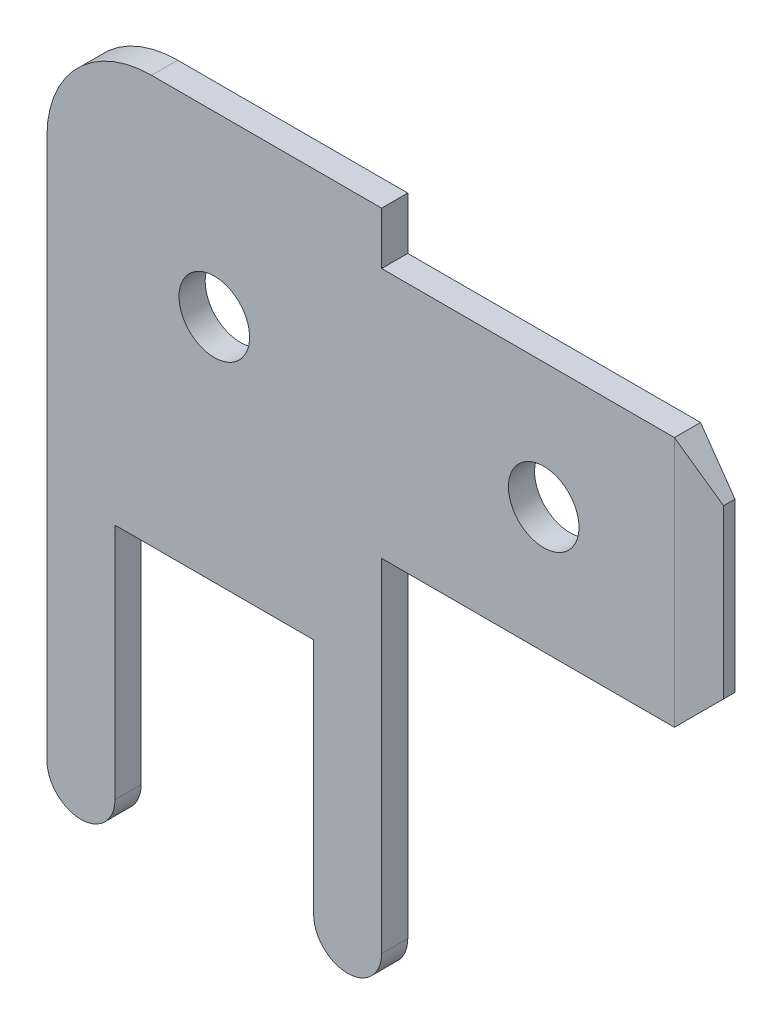
ISO-10303-21;
HEADER;
FILE_DESCRIPTION(('STEP AP214'),'2;1');
FILE_NAME('part.step','',(''),(''),'','','');
FILE_SCHEMA(('AUTOMOTIVE_DESIGN { 1 0 10303 214 1 1 1 1 }'));
ENDSEC;
DATA;
#1=APPLICATION_CONTEXT('core data for automotive mechanical design processes');
#2=APPLICATION_PROTOCOL_DEFINITION('international standard','automotive_design',2000,#1);
#3=PRODUCT_CONTEXT('',#1,'mechanical');
#4=PRODUCT('Part','Part','',(#3));
#5=PRODUCT_RELATED_PRODUCT_CATEGORY('part','',(#4));
#6=PRODUCT_DEFINITION_FORMATION('','',#4);
#7=PRODUCT_DEFINITION_CONTEXT('part definition',#1,'design');
#8=PRODUCT_DEFINITION('design','',#6,#7);
#9=PRODUCT_DEFINITION_SHAPE('','',#8);
#10=(LENGTH_UNIT() NAMED_UNIT(*) SI_UNIT(.MILLI.,.METRE.));
#11=(NAMED_UNIT(*) PLANE_ANGLE_UNIT() SI_UNIT($,.RADIAN.));
#12=(NAMED_UNIT(*) SI_UNIT($,.STERADIAN.) SOLID_ANGLE_UNIT());
#13=UNCERTAINTY_MEASURE_WITH_UNIT(LENGTH_MEASURE(1.E-05),#10,'distance_accuracy_value','');
#14=(GEOMETRIC_REPRESENTATION_CONTEXT(3) GLOBAL_UNCERTAINTY_ASSIGNED_CONTEXT((#13)) GLOBAL_UNIT_ASSIGNED_CONTEXT((#10,
#11,#12)) REPRESENTATION_CONTEXT('',''));
#15=CARTESIAN_POINT('',(0.,0.,0.));
#16=DIRECTION('',(0.,0.,1.));
#17=DIRECTION('',(1.,0.,0.));
#18=AXIS2_PLACEMENT_3D('',#15,#16,#17);
#19=CARTESIAN_POINT('',(9.6,0.,-0.141061584567));
#20=DIRECTION('',(-0.173648177667033,0.,-0.98480775301219));
#21=DIRECTION('',(-0.98480775301219,0.,0.173648177667033));
#22=AXIS2_PLACEMENT_3D('',#19,#20,#21);
#23=PLANE('',#22);
#24=DIRECTION('',(-0.701673843159846,-0.701673843159846,0.123724030206681));
#25=VECTOR('',#24,1.);
#26=CARTESIAN_POINT('',(9.6,2.8,-0.141061584567));
#27=LINE('',#26,#25);
#28=CARTESIAN_POINT('',(9.6,2.8,-0.141061584567));
#29=VERTEX_POINT('',#28);
#30=CARTESIAN_POINT('',(8.8,2.,0.));
#31=VERTEX_POINT('',#30);
#32=EDGE_CURVE('E195',#29,#31,#27,.T.);
#33=ORIENTED_EDGE('',*,*,#32,.F.);
#34=DIRECTION('',(0.,1.,0.));
#35=VECTOR('',#34,1.);
#36=CARTESIAN_POINT('',(9.6,2.8,-0.141061584567));
#37=LINE('',#36,#35);
#38=CARTESIAN_POINT('',(9.6,6.,-0.141061584567));
#39=VERTEX_POINT('',#38);
#40=EDGE_CURVE('E247',#39,#29,#37,.F.);
#41=ORIENTED_EDGE('',*,*,#40,.F.);
#42=DIRECTION('',(0.701673843159846,-0.701673843159846,-0.123724030206681));
#43=VECTOR('',#42,1.);
#44=CARTESIAN_POINT('',(8.8,6.8,0.));
#45=LINE('',#44,#43);
#46=CARTESIAN_POINT('',(8.8,6.8,0.));
#47=VERTEX_POINT('',#46);
#48=EDGE_CURVE('E244',#47,#39,#45,.T.);
#49=ORIENTED_EDGE('',*,*,#48,.F.);
#50=DIRECTION('',(0.,1.,0.));
#51=VECTOR('',#50,1.);
#52=CARTESIAN_POINT('',(8.8,0.,0.));
#53=LINE('',#52,#51);
#54=EDGE_CURVE('E186',#31,#47,#53,.T.);
#55=ORIENTED_EDGE('',*,*,#54,.F.);
#56=EDGE_LOOP('',(#33,#41,#49,#55));
#57=FACE_BOUND('',#56,.T.);
#58=ADVANCED_FACE('F17',(#57),#23,.F.);
#59=CARTESIAN_POINT('',(9.6,2.8,0.));
#60=DIRECTION('',(1.,0.,0.));
#61=DIRECTION('',(0.,0.,-1.));
#62=AXIS2_PLACEMENT_3D('',#59,#60,#61);
#63=PLANE('',#62);
#64=DIRECTION('',(0.,0.,1.));
#65=VECTOR('',#64,1.);
#66=CARTESIAN_POINT('',(9.6,2.8,0.));
#67=LINE('',#66,#65);
#68=CARTESIAN_POINT('',(9.60000000000002,2.8,-0.358938415433092));
#69=VERTEX_POINT('',#68);
#70=EDGE_CURVE('E197',#69,#29,#67,.T.);
#71=ORIENTED_EDGE('',*,*,#70,.F.);
#72=DIRECTION('',(0.,1.,0.));
#73=VECTOR('',#72,1.);
#74=CARTESIAN_POINT('',(9.60000000000002,0.,-0.358938415433138));
#75=LINE('',#74,#73);
#76=CARTESIAN_POINT('',(9.60000000000002,6.,-0.358938415433138));
#77=VERTEX_POINT('',#76);
#78=EDGE_CURVE('E180',#69,#77,#75,.T.);
#79=ORIENTED_EDGE('',*,*,#78,.T.);
#80=DIRECTION('',(0.,0.,1.));
#81=VECTOR('',#80,1.);
#82=CARTESIAN_POINT('',(9.6,6.,0.));
#83=LINE('',#82,#81);
#84=EDGE_CURVE('E246',#39,#77,#83,.F.);
#85=ORIENTED_EDGE('',*,*,#84,.F.);
#86=ORIENTED_EDGE('',*,*,#40,.T.);
#87=EDGE_LOOP('',(#71,#79,#85,#86));
#88=FACE_BOUND('',#87,.T.);
#89=ADVANCED_FACE('F522',(#88),#63,.T.);
#90=CARTESIAN_POINT('',(9.6,6.,0.));
#91=DIRECTION('',(0.707106781186548,0.707106781186548,0.));
#92=DIRECTION('',(-0.707106781186548,0.707106781186548,0.));
#93=AXIS2_PLACEMENT_3D('',#90,#91,#92);
#94=PLANE('',#93);
#95=ORIENTED_EDGE('',*,*,#84,.T.);
#96=DIRECTION('',(-0.701673843159867,0.701673843159846,-0.12372403020656));
#97=VECTOR('',#96,1.);
#98=CARTESIAN_POINT('',(9.60000000000002,6.,-0.358938415433138));
#99=LINE('',#98,#97);
#100=CARTESIAN_POINT('',(8.8,6.8,-0.5));
#101=VERTEX_POINT('',#100);
#102=EDGE_CURVE('E170',#77,#101,#99,.T.);
#103=ORIENTED_EDGE('',*,*,#102,.T.);
#104=DIRECTION('',(0.,0.,1.));
#105=VECTOR('',#104,1.);
#106=CARTESIAN_POINT('',(8.8,6.8,0.));
#107=LINE('',#106,#105);
#108=EDGE_CURVE('E168',#47,#101,#107,.F.);
#109=ORIENTED_EDGE('',*,*,#108,.F.);
#110=ORIENTED_EDGE('',*,*,#48,.T.);
#111=EDGE_LOOP('',(#95,#103,#109,#110));
#112=FACE_BOUND('',#111,.T.);
#113=ADVANCED_FACE('F513',(#112),#94,.T.);
#114=CARTESIAN_POINT('',(8.8,2.,0.));
#115=DIRECTION('',(0.707106781186548,-0.707106781186548,0.));
#116=DIRECTION('',(0.707106781186548,0.707106781186548,0.));
#117=AXIS2_PLACEMENT_3D('',#114,#115,#116);
#118=PLANE('',#117);
#119=DIRECTION('',(0.,0.,-1.));
#120=VECTOR('',#119,1.);
#121=CARTESIAN_POINT('',(8.8,2.,0.));
#122=LINE('',#121,#120);
#123=CARTESIAN_POINT('',(8.8,2.,-0.5));
#124=VERTEX_POINT('',#123);
#125=EDGE_CURVE('E189',#124,#31,#122,.F.);
#126=ORIENTED_EDGE('',*,*,#125,.F.);
#127=DIRECTION('',(0.701673843159867,0.701673843159847,0.12372403020656));
#128=VECTOR('',#127,1.);
#129=CARTESIAN_POINT('',(8.8,2.,-0.5));
#130=LINE('',#129,#128);
#131=EDGE_CURVE('E183',#124,#69,#130,.T.);
#132=ORIENTED_EDGE('',*,*,#131,.T.);
#133=ORIENTED_EDGE('',*,*,#70,.T.);
#134=ORIENTED_EDGE('',*,*,#32,.T.);
#135=EDGE_LOOP('',(#126,#132,#133,#134));
#136=FACE_BOUND('',#135,.T.);
#137=ADVANCED_FACE('F504',(#136),#118,.T.);
#138=CARTESIAN_POINT('',(0.,0.,0.));
#139=DIRECTION('',(0.,0.,1.));
#140=DIRECTION('',(1.,0.,0.));
#141=AXIS2_PLACEMENT_3D('',#138,#139,#140);
#142=PLANE('',#141);
#143=CARTESIAN_POINT('',(0.,4.4,0.));
#144=DIRECTION('',(0.,0.,-1.));
#145=DIRECTION('',(-1.,0.,0.));
#146=AXIS2_PLACEMENT_3D('',#143,#144,#145);
#147=CIRCLE('',#146,0.675);
#148=CARTESIAN_POINT('',(-0.675,4.4,0.));
#149=VERTEX_POINT('',#148);
#150=EDGE_CURVE('E175',#149,#149,#147,.T.);
#151=ORIENTED_EDGE('',*,*,#150,.T.);
#152=EDGE_LOOP('',(#151));
#153=FACE_BOUND('',#152,.T.);
#154=CARTESIAN_POINT('',(6.3,4.4,0.));
#155=DIRECTION('',(0.,0.,-1.));
#156=DIRECTION('',(-1.,0.,0.));
#157=AXIS2_PLACEMENT_3D('',#154,#155,#156);
#158=CIRCLE('',#157,0.675);
#159=CARTESIAN_POINT('',(5.625,4.4,0.));
#160=VERTEX_POINT('',#159);
#161=EDGE_CURVE('E204',#160,#160,#158,.T.);
#162=ORIENTED_EDGE('',*,*,#161,.T.);
#163=EDGE_LOOP('',(#162));
#164=FACE_BOUND('',#163,.T.);
#165=DIRECTION('',(1.,0.,0.));
#166=VECTOR('',#165,1.);
#167=CARTESIAN_POINT('',(3.2,2.,0.));
#168=LINE('',#167,#166);
#169=CARTESIAN_POINT('',(3.2,2.,0.));
#170=VERTEX_POINT('',#169);
#171=EDGE_CURVE('E192',#31,#170,#168,.F.);
#172=ORIENTED_EDGE('',*,*,#171,.F.);
#173=ORIENTED_EDGE('',*,*,#54,.T.);
#174=DIRECTION('',(1.,0.,0.));
#175=VECTOR('',#174,1.);
#176=CARTESIAN_POINT('',(8.8,6.8,0.));
#177=LINE('',#176,#175);
#178=CARTESIAN_POINT('',(3.2,6.8,0.));
#179=VERTEX_POINT('',#178);
#180=EDGE_CURVE('E160',#179,#47,#177,.T.);
#181=ORIENTED_EDGE('',*,*,#180,.F.);
#182=DIRECTION('',(0.,1.,0.));
#183=VECTOR('',#182,1.);
#184=CARTESIAN_POINT('',(3.2,6.8,0.));
#185=LINE('',#184,#183);
#186=CARTESIAN_POINT('',(3.2,7.8,0.));
#187=VERTEX_POINT('',#186);
#188=EDGE_CURVE('E128',#187,#179,#185,.F.);
#189=ORIENTED_EDGE('',*,*,#188,.F.);
#190=DIRECTION('',(1.,0.,0.));
#191=VECTOR('',#190,1.);
#192=CARTESIAN_POINT('',(3.2,7.8,0.));
#193=LINE('',#192,#191);
#194=CARTESIAN_POINT('',(-1.2,7.8,0.));
#195=VERTEX_POINT('',#194);
#196=EDGE_CURVE('E124',#195,#187,#193,.T.);
#197=ORIENTED_EDGE('',*,*,#196,.F.);
#198=CARTESIAN_POINT('',(-1.2,5.8,0.));
#199=DIRECTION('',(0.,0.,-1.));
#200=DIRECTION('',(-1.,0.,0.));
#201=AXIS2_PLACEMENT_3D('',#198,#199,#200);
#202=CIRCLE('',#201,2.);
#203=CARTESIAN_POINT('',(-3.2,5.8,0.));
#204=VERTEX_POINT('',#203);
#205=EDGE_CURVE('E20',#204,#195,#202,.T.);
#206=ORIENTED_EDGE('',*,*,#205,.F.);
#207=DIRECTION('',(0.,1.,0.));
#208=VECTOR('',#207,1.);
#209=CARTESIAN_POINT('',(-3.2,5.8,0.));
#210=LINE('',#209,#208);
#211=CARTESIAN_POINT('',(-3.2,-4.55,0.));
#212=VERTEX_POINT('',#211);
#213=EDGE_CURVE('E232',#212,#204,#210,.T.);
#214=ORIENTED_EDGE('',*,*,#213,.F.);
#215=CARTESIAN_POINT('',(-2.55,-4.55,0.));
#216=DIRECTION('',(0.,0.,-1.));
#217=DIRECTION('',(-1.,0.,0.));
#218=AXIS2_PLACEMENT_3D('',#215,#216,#217);
#219=CIRCLE('',#218,0.65);
#220=CARTESIAN_POINT('',(-1.9,-4.55,0.));
#221=VERTEX_POINT('',#220);
#222=EDGE_CURVE('E285',#221,#212,#219,.T.);
#223=ORIENTED_EDGE('',*,*,#222,.F.);
#224=DIRECTION('',(0.,1.,0.));
#225=VECTOR('',#224,1.);
#226=CARTESIAN_POINT('',(-1.9,-4.55,0.));
#227=LINE('',#226,#225);
#228=CARTESIAN_POINT('',(-1.9,0.,0.));
#229=VERTEX_POINT('',#228);
#230=EDGE_CURVE('E226',#229,#221,#227,.F.);
#231=ORIENTED_EDGE('',*,*,#230,.F.);
#232=DIRECTION('',(1.,0.,0.));
#233=VECTOR('',#232,1.);
#234=CARTESIAN_POINT('',(-1.9,0.,0.));
#235=LINE('',#234,#233);
#236=CARTESIAN_POINT('',(1.9,0.,0.));
#237=VERTEX_POINT('',#236);
#238=EDGE_CURVE('E220',#237,#229,#235,.F.);
#239=ORIENTED_EDGE('',*,*,#238,.F.);
#240=DIRECTION('',(0.,1.,0.));
#241=VECTOR('',#240,1.);
#242=CARTESIAN_POINT('',(1.9,0.,0.));
#243=LINE('',#242,#241);
#244=CARTESIAN_POINT('',(1.9,-4.55,0.));
#245=VERTEX_POINT('',#244);
#246=EDGE_CURVE('E213',#245,#237,#243,.T.);
#247=ORIENTED_EDGE('',*,*,#246,.F.);
#248=CARTESIAN_POINT('',(2.55,-4.55,0.));
#249=DIRECTION('',(0.,0.,-1.));
#250=DIRECTION('',(-1.,0.,0.));
#251=AXIS2_PLACEMENT_3D('',#248,#249,#250);
#252=CIRCLE('',#251,0.65);
#253=CARTESIAN_POINT('',(3.2,-4.55,0.));
#254=VERTEX_POINT('',#253);
#255=EDGE_CURVE('E283',#254,#245,#252,.T.);
#256=ORIENTED_EDGE('',*,*,#255,.F.);
#257=DIRECTION('',(0.,1.,0.));
#258=VECTOR('',#257,1.);
#259=CARTESIAN_POINT('',(3.2,-4.55,0.));
#260=LINE('',#259,#258);
#261=EDGE_CURVE('E207',#170,#254,#260,.F.);
#262=ORIENTED_EDGE('',*,*,#261,.F.);
#263=EDGE_LOOP('',(#172,#173,#181,#189,#197,#206,#214,#223,#231,#239,#247,#256,#262));
#264=FACE_BOUND('',#263,.T.);
#265=ADVANCED_FACE('F126',(#153,#164,#264),#142,.T.);
#266=CARTESIAN_POINT('',(8.8,0.,-0.5));
#267=DIRECTION('',(-0.173648177667033,0.,0.98480775301219));
#268=DIRECTION('',(0.98480775301219,0.,0.173648177667033));
#269=AXIS2_PLACEMENT_3D('',#266,#267,#268);
#270=PLANE('',#269);
#271=ORIENTED_EDGE('',*,*,#102,.F.);
#272=ORIENTED_EDGE('',*,*,#78,.F.);
#273=ORIENTED_EDGE('',*,*,#131,.F.);
#274=DIRECTION('',(0.,1.,0.));
#275=VECTOR('',#274,1.);
#276=CARTESIAN_POINT('',(8.8,0.,-0.5));
#277=LINE('',#276,#275);
#278=EDGE_CURVE('E165',#124,#101,#277,.T.);
#279=ORIENTED_EDGE('',*,*,#278,.T.);
#280=EDGE_LOOP('',(#271,#272,#273,#279));
#281=FACE_BOUND('',#280,.T.);
#282=ADVANCED_FACE('F487',(#281),#270,.F.);
#283=CARTESIAN_POINT('',(8.8,6.8,0.));
#284=DIRECTION('',(0.,1.,0.));
#285=DIRECTION('',(0.,0.,1.));
#286=AXIS2_PLACEMENT_3D('',#283,#284,#285);
#287=PLANE('',#286);
#288=DIRECTION('',(0.,0.,-1.));
#289=VECTOR('',#288,1.);
#290=CARTESIAN_POINT('',(3.2,6.8,0.));
#291=LINE('',#290,#289);
#292=CARTESIAN_POINT('',(3.2,6.8,-0.5));
#293=VERTEX_POINT('',#292);
#294=EDGE_CURVE('E158',#179,#293,#291,.T.);
#295=ORIENTED_EDGE('',*,*,#294,.F.);
#296=ORIENTED_EDGE('',*,*,#180,.T.);
#297=ORIENTED_EDGE('',*,*,#108,.T.);
#298=DIRECTION('',(1.,0.,0.));
#299=VECTOR('',#298,1.);
#300=CARTESIAN_POINT('',(0.,6.8,-0.5));
#301=LINE('',#300,#299);
#302=EDGE_CURVE('E155',#101,#293,#301,.F.);
#303=ORIENTED_EDGE('',*,*,#302,.T.);
#304=EDGE_LOOP('',(#295,#296,#297,#303));
#305=FACE_BOUND('',#304,.T.);
#306=ADVANCED_FACE('F478',(#305),#287,.T.);
#307=CARTESIAN_POINT('',(3.2,6.8,0.));
#308=DIRECTION('',(1.,0.,0.));
#309=DIRECTION('',(0.,0.,-1.));
#310=AXIS2_PLACEMENT_3D('',#307,#308,#309);
#311=PLANE('',#310);
#312=DIRECTION('',(0.,0.,1.));
#313=VECTOR('',#312,1.);
#314=CARTESIAN_POINT('',(3.2,7.8,0.));
#315=LINE('',#314,#313);
#316=CARTESIAN_POINT('',(3.2,7.8,-0.5));
#317=VERTEX_POINT('',#316);
#318=EDGE_CURVE('E133',#187,#317,#315,.F.);
#319=ORIENTED_EDGE('',*,*,#318,.F.);
#320=ORIENTED_EDGE('',*,*,#188,.T.);
#321=ORIENTED_EDGE('',*,*,#294,.T.);
#322=DIRECTION('',(0.,1.,0.));
#323=VECTOR('',#322,1.);
#324=CARTESIAN_POINT('',(3.2,0.,-0.5));
#325=LINE('',#324,#323);
#326=EDGE_CURVE('E152',#293,#317,#325,.T.);
#327=ORIENTED_EDGE('',*,*,#326,.T.);
#328=EDGE_LOOP('',(#319,#320,#321,#327));
#329=FACE_BOUND('',#328,.T.);
#330=ADVANCED_FACE('F470',(#329),#311,.T.);
#331=CARTESIAN_POINT('',(3.2,7.8,0.));
#332=DIRECTION('',(0.,1.,0.));
#333=DIRECTION('',(0.,0.,1.));
#334=AXIS2_PLACEMENT_3D('',#331,#332,#333);
#335=PLANE('',#334);
#336=DIRECTION('',(0.,0.,-1.));
#337=VECTOR('',#336,1.);
#338=CARTESIAN_POINT('',(-1.2,7.8,0.));
#339=LINE('',#338,#337);
#340=CARTESIAN_POINT('',(-1.2,7.8,-0.5));
#341=VERTEX_POINT('',#340);
#342=EDGE_CURVE('E132',#195,#341,#339,.T.);
#343=ORIENTED_EDGE('',*,*,#342,.F.);
#344=ORIENTED_EDGE('',*,*,#196,.T.);
#345=ORIENTED_EDGE('',*,*,#318,.T.);
#346=DIRECTION('',(1.,0.,0.));
#347=VECTOR('',#346,1.);
#348=CARTESIAN_POINT('',(0.,7.8,-0.5));
#349=LINE('',#348,#347);
#350=EDGE_CURVE('E144',#317,#341,#349,.F.);
#351=ORIENTED_EDGE('',*,*,#350,.T.);
#352=EDGE_LOOP('',(#343,#344,#345,#351));
#353=FACE_BOUND('',#352,.T.);
#354=ADVANCED_FACE('F142',(#353),#335,.T.);
#355=CARTESIAN_POINT('',(-1.2,5.8,0.));
#356=DIRECTION('',(0.,0.,-1.));
#357=DIRECTION('',(-1.,0.,0.));
#358=AXIS2_PLACEMENT_3D('',#355,#356,#357);
#359=CYLINDRICAL_SURFACE('',#358,2.);
#360=DIRECTION('',(0.,0.,1.));
#361=VECTOR('',#360,1.);
#362=CARTESIAN_POINT('',(-3.2,5.8,0.));
#363=LINE('',#362,#361);
#364=CARTESIAN_POINT('',(-3.2,5.8,-0.5));
#365=VERTEX_POINT('',#364);
#366=EDGE_CURVE('E140',#204,#365,#363,.F.);
#367=ORIENTED_EDGE('',*,*,#366,.F.);
#368=ORIENTED_EDGE('',*,*,#205,.T.);
#369=ORIENTED_EDGE('',*,*,#342,.T.);
#370=CARTESIAN_POINT('',(-1.2,5.8,-0.5));
#371=DIRECTION('',(0.,0.,-1.));
#372=DIRECTION('',(-1.,0.,0.));
#373=AXIS2_PLACEMENT_3D('',#370,#371,#372);
#374=CIRCLE('',#373,2.);
#375=EDGE_CURVE('E277',#341,#365,#374,.F.);
#376=ORIENTED_EDGE('',*,*,#375,.T.);
#377=EDGE_LOOP('',(#367,#368,#369,#376));
#378=FACE_BOUND('',#377,.T.);
#379=ADVANCED_FACE('F137',(#378),#359,.T.);
#380=CARTESIAN_POINT('',(-3.2,5.8,0.));
#381=DIRECTION('',(-1.,0.,0.));
#382=DIRECTION('',(0.,0.,1.));
#383=AXIS2_PLACEMENT_3D('',#380,#381,#382);
#384=PLANE('',#383);
#385=DIRECTION('',(0.,0.,-1.));
#386=VECTOR('',#385,1.);
#387=CARTESIAN_POINT('',(-3.2,-4.55,0.));
#388=LINE('',#387,#386);
#389=CARTESIAN_POINT('',(-3.2,-4.55,-0.5));
#390=VERTEX_POINT('',#389);
#391=EDGE_CURVE('E233',#212,#390,#388,.T.);
#392=ORIENTED_EDGE('',*,*,#391,.F.);
#393=ORIENTED_EDGE('',*,*,#213,.T.);
#394=ORIENTED_EDGE('',*,*,#366,.T.);
#395=DIRECTION('',(0.,1.,0.));
#396=VECTOR('',#395,1.);
#397=CARTESIAN_POINT('',(-3.2,0.,-0.5));
#398=LINE('',#397,#396);
#399=EDGE_CURVE('E276',#365,#390,#398,.F.);
#400=ORIENTED_EDGE('',*,*,#399,.T.);
#401=EDGE_LOOP('',(#392,#393,#394,#400));
#402=FACE_BOUND('',#401,.T.);
#403=ADVANCED_FACE('F353',(#402),#384,.T.);
#404=CARTESIAN_POINT('',(-2.55,-4.55,0.));
#405=DIRECTION('',(0.,0.,-1.));
#406=DIRECTION('',(-1.,0.,0.));
#407=AXIS2_PLACEMENT_3D('',#404,#405,#406);
#408=CYLINDRICAL_SURFACE('',#407,0.65);
#409=DIRECTION('',(0.,0.,-1.));
#410=VECTOR('',#409,1.);
#411=CARTESIAN_POINT('',(-1.9,-4.55,0.));
#412=LINE('',#411,#410);
#413=CARTESIAN_POINT('',(-1.9,-4.55,-0.5));
#414=VERTEX_POINT('',#413);
#415=EDGE_CURVE('E229',#221,#414,#412,.T.);
#416=ORIENTED_EDGE('',*,*,#415,.F.);
#417=ORIENTED_EDGE('',*,*,#222,.T.);
#418=ORIENTED_EDGE('',*,*,#391,.T.);
#419=CARTESIAN_POINT('',(-2.55,-4.55,-0.5));
#420=DIRECTION('',(0.,0.,-1.));
#421=DIRECTION('',(-1.,0.,0.));
#422=AXIS2_PLACEMENT_3D('',#419,#420,#421);
#423=CIRCLE('',#422,0.65);
#424=EDGE_CURVE('E272',#390,#414,#423,.F.);
#425=ORIENTED_EDGE('',*,*,#424,.T.);
#426=EDGE_LOOP('',(#416,#417,#418,#425));
#427=FACE_BOUND('',#426,.T.);
#428=ADVANCED_FACE('F351',(#427),#408,.T.);
#429=CARTESIAN_POINT('',(-1.9,-4.55,0.));
#430=DIRECTION('',(1.,0.,0.));
#431=DIRECTION('',(0.,0.,-1.));
#432=AXIS2_PLACEMENT_3D('',#429,#430,#431);
#433=PLANE('',#432);
#434=DIRECTION('',(0.,0.,-1.));
#435=VECTOR('',#434,1.);
#436=CARTESIAN_POINT('',(-1.9,0.,0.));
#437=LINE('',#436,#435);
#438=CARTESIAN_POINT('',(-1.9,0.,-0.5));
#439=VERTEX_POINT('',#438);
#440=EDGE_CURVE('E223',#229,#439,#437,.T.);
#441=ORIENTED_EDGE('',*,*,#440,.F.);
#442=ORIENTED_EDGE('',*,*,#230,.T.);
#443=ORIENTED_EDGE('',*,*,#415,.T.);
#444=DIRECTION('',(0.,1.,0.));
#445=VECTOR('',#444,1.);
#446=CARTESIAN_POINT('',(-1.9,0.,-0.5));
#447=LINE('',#446,#445);
#448=EDGE_CURVE('E275',#414,#439,#447,.T.);
#449=ORIENTED_EDGE('',*,*,#448,.T.);
#450=EDGE_LOOP('',(#441,#442,#443,#449));
#451=FACE_BOUND('',#450,.T.);
#452=ADVANCED_FACE('F349',(#451),#433,.T.);
#453=CARTESIAN_POINT('',(-1.9,0.,0.));
#454=DIRECTION('',(0.,-1.,0.));
#455=DIRECTION('',(0.,0.,-1.));
#456=AXIS2_PLACEMENT_3D('',#453,#454,#455);
#457=PLANE('',#456);
#458=DIRECTION('',(0.,0.,1.));
#459=VECTOR('',#458,1.);
#460=CARTESIAN_POINT('',(1.9,0.,0.));
#461=LINE('',#460,#459);
#462=CARTESIAN_POINT('',(1.9,0.,-0.5));
#463=VERTEX_POINT('',#462);
#464=EDGE_CURVE('E217',#237,#463,#461,.F.);
#465=ORIENTED_EDGE('',*,*,#464,.F.);
#466=ORIENTED_EDGE('',*,*,#238,.T.);
#467=ORIENTED_EDGE('',*,*,#440,.T.);
#468=DIRECTION('',(1.,0.,0.));
#469=VECTOR('',#468,1.);
#470=CARTESIAN_POINT('',(0.,0.,-0.5));
#471=LINE('',#470,#469);
#472=EDGE_CURVE('E298',#439,#463,#471,.T.);
#473=ORIENTED_EDGE('',*,*,#472,.T.);
#474=EDGE_LOOP('',(#465,#466,#467,#473));
#475=FACE_BOUND('',#474,.T.);
#476=ADVANCED_FACE('F346',(#475),#457,.T.);
#477=CARTESIAN_POINT('',(1.9,0.,0.));
#478=DIRECTION('',(-1.,0.,0.));
#479=DIRECTION('',(0.,0.,1.));
#480=AXIS2_PLACEMENT_3D('',#477,#478,#479);
#481=PLANE('',#480);
#482=DIRECTION('',(0.,0.,-1.));
#483=VECTOR('',#482,1.);
#484=CARTESIAN_POINT('',(1.9,-4.55,0.));
#485=LINE('',#484,#483);
#486=CARTESIAN_POINT('',(1.9,-4.55,-0.5));
#487=VERTEX_POINT('',#486);
#488=EDGE_CURVE('E216',#245,#487,#485,.T.);
#489=ORIENTED_EDGE('',*,*,#488,.F.);
#490=ORIENTED_EDGE('',*,*,#246,.T.);
#491=ORIENTED_EDGE('',*,*,#464,.T.);
#492=DIRECTION('',(0.,1.,0.));
#493=VECTOR('',#492,1.);
#494=CARTESIAN_POINT('',(1.9,0.,-0.5));
#495=LINE('',#494,#493);
#496=EDGE_CURVE('E271',#463,#487,#495,.F.);
#497=ORIENTED_EDGE('',*,*,#496,.T.);
#498=EDGE_LOOP('',(#489,#490,#491,#497));
#499=FACE_BOUND('',#498,.T.);
#500=ADVANCED_FACE('F341',(#499),#481,.T.);
#501=CARTESIAN_POINT('',(2.55,-4.55,0.));
#502=DIRECTION('',(0.,0.,-1.));
#503=DIRECTION('',(-1.,0.,0.));
#504=AXIS2_PLACEMENT_3D('',#501,#502,#503);
#505=CYLINDRICAL_SURFACE('',#504,0.65);
#506=DIRECTION('',(0.,0.,-1.));
#507=VECTOR('',#506,1.);
#508=CARTESIAN_POINT('',(3.2,-4.55,0.));
#509=LINE('',#508,#507);
#510=CARTESIAN_POINT('',(3.2,-4.55,-0.5));
#511=VERTEX_POINT('',#510);
#512=EDGE_CURVE('E210',#254,#511,#509,.T.);
#513=ORIENTED_EDGE('',*,*,#512,.F.);
#514=ORIENTED_EDGE('',*,*,#255,.T.);
#515=ORIENTED_EDGE('',*,*,#488,.T.);
#516=CARTESIAN_POINT('',(2.55,-4.55,-0.5));
#517=DIRECTION('',(0.,0.,-1.));
#518=DIRECTION('',(-1.,0.,0.));
#519=AXIS2_PLACEMENT_3D('',#516,#517,#518);
#520=CIRCLE('',#519,0.65);
#521=EDGE_CURVE('E267',#487,#511,#520,.F.);
#522=ORIENTED_EDGE('',*,*,#521,.T.);
#523=EDGE_LOOP('',(#513,#514,#515,#522));
#524=FACE_BOUND('',#523,.T.);
#525=ADVANCED_FACE('F338',(#524),#505,.T.);
#526=CARTESIAN_POINT('',(3.2,-4.55,0.));
#527=DIRECTION('',(1.,0.,0.));
#528=DIRECTION('',(0.,0.,-1.));
#529=AXIS2_PLACEMENT_3D('',#526,#527,#528);
#530=PLANE('',#529);
#531=DIRECTION('',(0.,0.,-1.));
#532=VECTOR('',#531,1.);
#533=CARTESIAN_POINT('',(3.2,2.,0.));
#534=LINE('',#533,#532);
#535=CARTESIAN_POINT('',(3.2,2.,-0.5));
#536=VERTEX_POINT('',#535);
#537=EDGE_CURVE('E35',#170,#536,#534,.T.);
#538=ORIENTED_EDGE('',*,*,#537,.F.);
#539=ORIENTED_EDGE('',*,*,#261,.T.);
#540=ORIENTED_EDGE('',*,*,#512,.T.);
#541=DIRECTION('',(0.,1.,0.));
#542=VECTOR('',#541,1.);
#543=CARTESIAN_POINT('',(3.2,0.,-0.5));
#544=LINE('',#543,#542);
#545=EDGE_CURVE('E270',#511,#536,#544,.T.);
#546=ORIENTED_EDGE('',*,*,#545,.T.);
#547=EDGE_LOOP('',(#538,#539,#540,#546));
#548=FACE_BOUND('',#547,.T.);
#549=ADVANCED_FACE('F330',(#548),#530,.T.);
#550=CARTESIAN_POINT('',(3.2,2.,0.));
#551=DIRECTION('',(0.,-1.,0.));
#552=DIRECTION('',(0.,0.,-1.));
#553=AXIS2_PLACEMENT_3D('',#550,#551,#552);
#554=PLANE('',#553);
#555=ORIENTED_EDGE('',*,*,#125,.T.);
#556=ORIENTED_EDGE('',*,*,#171,.T.);
#557=ORIENTED_EDGE('',*,*,#537,.T.);
#558=DIRECTION('',(1.,0.,0.));
#559=VECTOR('',#558,1.);
#560=CARTESIAN_POINT('',(0.,2.,-0.5));
#561=LINE('',#560,#559);
#562=EDGE_CURVE('E266',#536,#124,#561,.T.);
#563=ORIENTED_EDGE('',*,*,#562,.T.);
#564=EDGE_LOOP('',(#555,#556,#557,#563));
#565=FACE_BOUND('',#564,.T.);
#566=ADVANCED_FACE('F378',(#565),#554,.T.);
#567=CARTESIAN_POINT('',(6.3,4.4,0.));
#568=DIRECTION('',(0.,0.,-1.));
#569=DIRECTION('',(-1.,0.,0.));
#570=AXIS2_PLACEMENT_3D('',#567,#568,#569);
#571=CYLINDRICAL_SURFACE('',#570,0.675);
#572=CARTESIAN_POINT('',(6.3,4.4,-0.5));
#573=DIRECTION('',(0.,0.,-1.));
#574=DIRECTION('',(-1.,0.,0.));
#575=AXIS2_PLACEMENT_3D('',#572,#573,#574);
#576=CIRCLE('',#575,0.675);
#577=CARTESIAN_POINT('',(5.625,4.4,-0.5));
#578=VERTEX_POINT('',#577);
#579=EDGE_CURVE('E26',#578,#578,#576,.T.);
#580=ORIENTED_EDGE('',*,*,#579,.T.);
#581=EDGE_LOOP('',(#580));
#582=FACE_BOUND('',#581,.T.);
#583=ORIENTED_EDGE('',*,*,#161,.F.);
#584=EDGE_LOOP('',(#583));
#585=FACE_BOUND('',#584,.T.);
#586=ADVANCED_FACE('F370',(#582,#585),#571,.F.);
#587=CARTESIAN_POINT('',(0.,4.4,0.));
#588=DIRECTION('',(0.,0.,-1.));
#589=DIRECTION('',(-1.,0.,0.));
#590=AXIS2_PLACEMENT_3D('',#587,#588,#589);
#591=CYLINDRICAL_SURFACE('',#590,0.675);
#592=CARTESIAN_POINT('',(0.,4.4,-0.5));
#593=DIRECTION('',(0.,0.,-1.));
#594=DIRECTION('',(-1.,0.,0.));
#595=AXIS2_PLACEMENT_3D('',#592,#593,#594);
#596=CIRCLE('',#595,0.675);
#597=CARTESIAN_POINT('',(-0.675,4.4,-0.5));
#598=VERTEX_POINT('',#597);
#599=EDGE_CURVE('E11',#598,#598,#596,.T.);
#600=ORIENTED_EDGE('',*,*,#599,.T.);
#601=EDGE_LOOP('',(#600));
#602=FACE_BOUND('',#601,.T.);
#603=ORIENTED_EDGE('',*,*,#150,.F.);
#604=EDGE_LOOP('',(#603));
#605=FACE_BOUND('',#604,.T.);
#606=ADVANCED_FACE('F364',(#602,#605),#591,.F.);
#607=CARTESIAN_POINT('',(0.,0.,-0.5));
#608=DIRECTION('',(0.,0.,1.));
#609=DIRECTION('',(1.,0.,0.));
#610=AXIS2_PLACEMENT_3D('',#607,#608,#609);
#611=PLANE('',#610);
#612=ORIENTED_EDGE('',*,*,#599,.F.);
#613=EDGE_LOOP('',(#612));
#614=FACE_BOUND('',#613,.T.);
#615=ORIENTED_EDGE('',*,*,#579,.F.);
#616=EDGE_LOOP('',(#615));
#617=FACE_BOUND('',#616,.T.);
#618=ORIENTED_EDGE('',*,*,#545,.F.);
#619=ORIENTED_EDGE('',*,*,#521,.F.);
#620=ORIENTED_EDGE('',*,*,#496,.F.);
#621=ORIENTED_EDGE('',*,*,#472,.F.);
#622=ORIENTED_EDGE('',*,*,#448,.F.);
#623=ORIENTED_EDGE('',*,*,#424,.F.);
#624=ORIENTED_EDGE('',*,*,#399,.F.);
#625=ORIENTED_EDGE('',*,*,#375,.F.);
#626=ORIENTED_EDGE('',*,*,#350,.F.);
#627=ORIENTED_EDGE('',*,*,#326,.F.);
#628=ORIENTED_EDGE('',*,*,#302,.F.);
#629=ORIENTED_EDGE('',*,*,#278,.F.);
#630=ORIENTED_EDGE('',*,*,#562,.F.);
#631=EDGE_LOOP('',(#618,#619,#620,#621,#622,#623,#624,#625,#626,#627,#628,#629,#630));
#632=FACE_BOUND('',#631,.T.);
#633=ADVANCED_FACE('F334',(#614,#617,#632),#611,.F.);
#634=CLOSED_SHELL('',(#58,#89,#113,#137,#265,#282,#306,#330,#354,#379,#403,#428,#452,#476,#500,
#525,#549,#566,#586,#606,#633));
#635=MANIFOLD_SOLID_BREP('B1',#634);
#636=ADVANCED_BREP_SHAPE_REPRESENTATION('',(#18,#635),#14);
#637=SHAPE_DEFINITION_REPRESENTATION(#9,#636);
ENDSEC;
END-ISO-10303-21;
